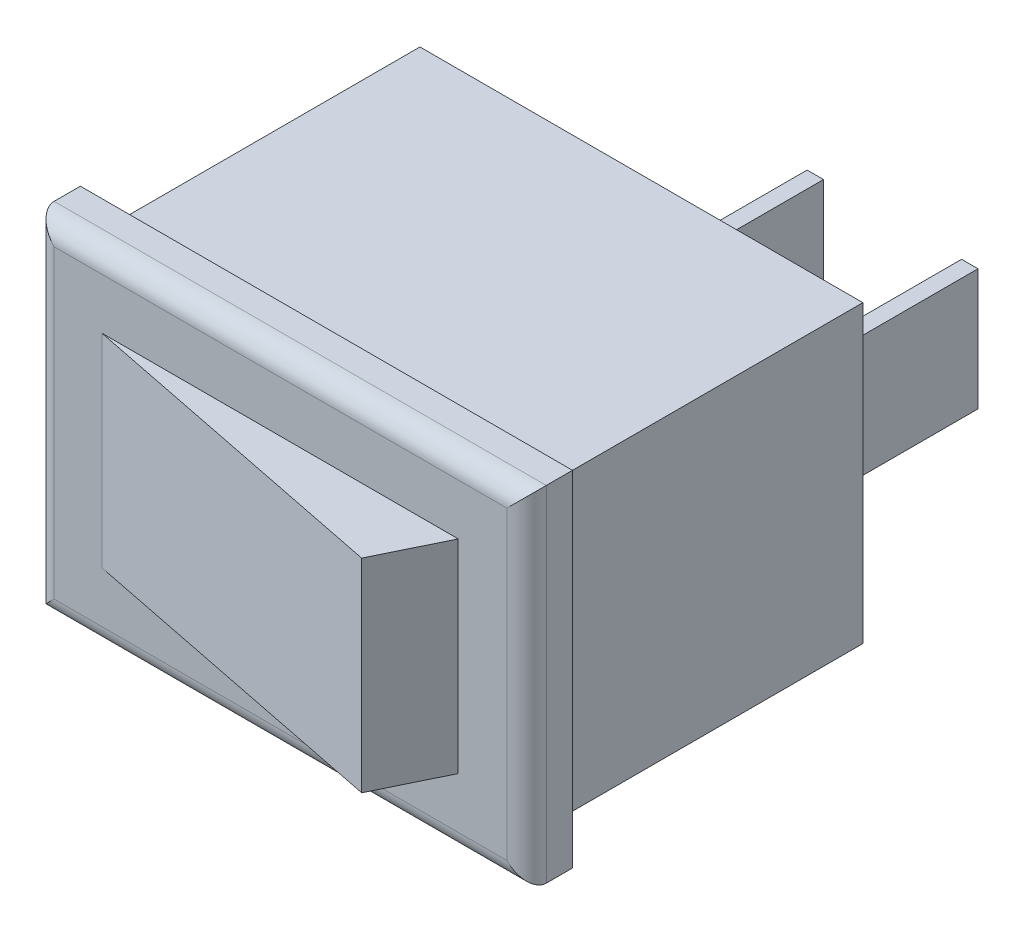
ISO-10303-21;
HEADER;
FILE_DESCRIPTION(('STEP AP214'),'2;1');
FILE_NAME('part.step','',(''),(''),'','','');
FILE_SCHEMA(('AUTOMOTIVE_DESIGN { 1 0 10303 214 1 1 1 1 }'));
ENDSEC;
DATA;
#1=APPLICATION_CONTEXT('core data for automotive mechanical design processes');
#2=APPLICATION_PROTOCOL_DEFINITION('international standard','automotive_design',2000,#1);
#3=PRODUCT_CONTEXT('',#1,'mechanical');
#4=PRODUCT('Part','Part','',(#3));
#5=PRODUCT_RELATED_PRODUCT_CATEGORY('part','',(#4));
#6=PRODUCT_DEFINITION_FORMATION('','',#4);
#7=PRODUCT_DEFINITION_CONTEXT('part definition',#1,'design');
#8=PRODUCT_DEFINITION('design','',#6,#7);
#9=PRODUCT_DEFINITION_SHAPE('','',#8);
#10=(LENGTH_UNIT() NAMED_UNIT(*) SI_UNIT(.MILLI.,.METRE.));
#11=(NAMED_UNIT(*) PLANE_ANGLE_UNIT() SI_UNIT($,.RADIAN.));
#12=(NAMED_UNIT(*) SI_UNIT($,.STERADIAN.) SOLID_ANGLE_UNIT());
#13=UNCERTAINTY_MEASURE_WITH_UNIT(LENGTH_MEASURE(1.E-05),#10,'distance_accuracy_value','');
#14=(GEOMETRIC_REPRESENTATION_CONTEXT(3) GLOBAL_UNCERTAINTY_ASSIGNED_CONTEXT((#13)) GLOBAL_UNIT_ASSIGNED_CONTEXT((#10,
#11,#12)) REPRESENTATION_CONTEXT('',''));
#15=CARTESIAN_POINT('',(0.,0.,0.));
#16=DIRECTION('',(0.,0.,1.));
#17=DIRECTION('',(1.,0.,0.));
#18=AXIS2_PLACEMENT_3D('',#15,#16,#17);
#19=CARTESIAN_POINT('',(0.,0.,-0.3));
#20=DIRECTION('',(0.,0.,1.));
#21=DIRECTION('',(1.,0.,0.));
#22=AXIS2_PLACEMENT_3D('',#19,#20,#21);
#23=PLANE('',#22);
#24=DIRECTION('',(1.,0.,0.));
#25=VECTOR('',#24,1.);
#26=CARTESIAN_POINT('',(5.62503316837021,2.5,-0.3));
#27=LINE('',#26,#25);
#28=CARTESIAN_POINT('',(3.7945058503396,2.5,-0.3));
#29=VERTEX_POINT('',#28);
#30=CARTESIAN_POINT('',(5.62503316837021,2.5,-0.3));
#31=VERTEX_POINT('',#30);
#32=EDGE_CURVE('E271',#29,#31,#27,.T.);
#33=ORIENTED_EDGE('',*,*,#32,.T.);
#34=DIRECTION('',(0.,-1.,0.));
#35=VECTOR('',#34,1.);
#36=CARTESIAN_POINT('',(5.62503316837021,-2.5,-0.3));
#37=LINE('',#36,#35);
#38=CARTESIAN_POINT('',(5.62503316837021,-2.5,-0.3));
#39=VERTEX_POINT('',#38);
#40=EDGE_CURVE('E274',#31,#39,#37,.T.);
#41=ORIENTED_EDGE('',*,*,#40,.T.);
#42=DIRECTION('',(-1.,0.,0.));
#43=VECTOR('',#42,1.);
#44=CARTESIAN_POINT('',(3.7945058503396,-2.5,-0.3));
#45=LINE('',#44,#43);
#46=CARTESIAN_POINT('',(3.7945058503396,-2.5,-0.3));
#47=VERTEX_POINT('',#46);
#48=EDGE_CURVE('E277',#39,#47,#45,.T.);
#49=ORIENTED_EDGE('',*,*,#48,.T.);
#50=DIRECTION('',(0.,1.,0.));
#51=VECTOR('',#50,1.);
#52=CARTESIAN_POINT('',(3.7945058503396,2.5,-0.3));
#53=LINE('',#52,#51);
#54=EDGE_CURVE('E279',#47,#29,#53,.T.);
#55=ORIENTED_EDGE('',*,*,#54,.T.);
#56=EDGE_LOOP('',(#33,#41,#49,#55));
#57=FACE_BOUND('',#56,.T.);
#58=DIRECTION('',(0.,-1.,0.));
#59=VECTOR('',#58,1.);
#60=CARTESIAN_POINT('',(4.95976950935491,-1.85,-0.3));
#61=LINE('',#60,#59);
#62=CARTESIAN_POINT('',(4.95976950935491,1.85,-0.3));
#63=VERTEX_POINT('',#62);
#64=CARTESIAN_POINT('',(4.95976950935491,-1.85,-0.3));
#65=VERTEX_POINT('',#64);
#66=EDGE_CURVE('E261',#63,#65,#61,.T.);
#67=ORIENTED_EDGE('',*,*,#66,.F.);
#68=DIRECTION('',(1.,0.,0.));
#69=VECTOR('',#68,1.);
#70=CARTESIAN_POINT('',(4.95976950935491,1.85,-0.3));
#71=LINE('',#70,#69);
#72=CARTESIAN_POINT('',(4.45976950935491,1.85,-0.3));
#73=VERTEX_POINT('',#72);
#74=EDGE_CURVE('E258',#73,#63,#71,.T.);
#75=ORIENTED_EDGE('',*,*,#74,.F.);
#76=DIRECTION('',(0.,1.,0.));
#77=VECTOR('',#76,1.);
#78=CARTESIAN_POINT('',(4.45976950935491,1.85,-0.3));
#79=LINE('',#78,#77);
#80=CARTESIAN_POINT('',(4.45976950935491,-1.85,-0.3));
#81=VERTEX_POINT('',#80);
#82=EDGE_CURVE('E474',#81,#73,#79,.T.);
#83=ORIENTED_EDGE('',*,*,#82,.F.);
#84=DIRECTION('',(-1.,0.,0.));
#85=VECTOR('',#84,1.);
#86=CARTESIAN_POINT('',(4.45976950935491,-1.85,-0.3));
#87=LINE('',#86,#85);
#88=EDGE_CURVE('E472',#65,#81,#87,.T.);
#89=ORIENTED_EDGE('',*,*,#88,.F.);
#90=EDGE_LOOP('',(#67,#75,#83,#89));
#91=FACE_BOUND('',#90,.T.);
#92=ADVANCED_FACE('F46',(#57,#91),#23,.F.);
#93=CARTESIAN_POINT('',(0.,0.,0.));
#94=DIRECTION('',(0.,0.,1.));
#95=DIRECTION('',(1.,0.,0.));
#96=AXIS2_PLACEMENT_3D('',#93,#94,#95);
#97=PLANE('',#96);
#98=DIRECTION('',(1.,0.,0.));
#99=VECTOR('',#98,1.);
#100=CARTESIAN_POINT('',(0.915263659015306,2.5,0.));
#101=LINE('',#100,#99);
#102=CARTESIAN_POINT('',(-0.915263659015306,2.5,0.));
#103=VERTEX_POINT('',#102);
#104=CARTESIAN_POINT('',(0.915263659015306,2.5,0.));
#105=VERTEX_POINT('',#104);
#106=EDGE_CURVE('E333',#103,#105,#101,.T.);
#107=ORIENTED_EDGE('',*,*,#106,.F.);
#108=DIRECTION('',(0.,1.,0.));
#109=VECTOR('',#108,1.);
#110=CARTESIAN_POINT('',(-0.915263659015306,2.5,0.));
#111=LINE('',#110,#109);
#112=CARTESIAN_POINT('',(-0.915263659015306,-2.5,0.));
#113=VERTEX_POINT('',#112);
#114=EDGE_CURVE('E338',#113,#103,#111,.T.);
#115=ORIENTED_EDGE('',*,*,#114,.F.);
#116=DIRECTION('',(-1.,0.,0.));
#117=VECTOR('',#116,1.);
#118=CARTESIAN_POINT('',(-0.915263659015306,-2.5,0.));
#119=LINE('',#118,#117);
#120=CARTESIAN_POINT('',(0.915263659015306,-2.5,0.));
#121=VERTEX_POINT('',#120);
#122=EDGE_CURVE('E350',#121,#113,#119,.T.);
#123=ORIENTED_EDGE('',*,*,#122,.F.);
#124=DIRECTION('',(0.,-1.,0.));
#125=VECTOR('',#124,1.);
#126=CARTESIAN_POINT('',(0.915263659015306,-2.5,0.));
#127=LINE('',#126,#125);
#128=EDGE_CURVE('E347',#105,#121,#127,.T.);
#129=ORIENTED_EDGE('',*,*,#128,.F.);
#130=EDGE_LOOP('',(#107,#115,#123,#129));
#131=FACE_BOUND('',#130,.T.);
#132=DIRECTION('',(-1.,0.,0.));
#133=VECTOR('',#132,1.);
#134=CARTESIAN_POINT('',(-6.75,-4.5,0.));
#135=LINE('',#134,#133);
#136=CARTESIAN_POINT('',(6.75,-4.5,0.));
#137=VERTEX_POINT('',#136);
#138=CARTESIAN_POINT('',(-6.75,-4.5,0.));
#139=VERTEX_POINT('',#138);
#140=EDGE_CURVE('E367',#137,#139,#135,.T.);
#141=ORIENTED_EDGE('',*,*,#140,.T.);
#142=DIRECTION('',(0.,1.,0.));
#143=VECTOR('',#142,1.);
#144=CARTESIAN_POINT('',(-6.75,4.5,0.));
#145=LINE('',#144,#143);
#146=CARTESIAN_POINT('',(-6.75,4.5,0.));
#147=VERTEX_POINT('',#146);
#148=EDGE_CURVE('E370',#139,#147,#145,.T.);
#149=ORIENTED_EDGE('',*,*,#148,.T.);
#150=DIRECTION('',(1.,0.,0.));
#151=VECTOR('',#150,1.);
#152=CARTESIAN_POINT('',(6.75,4.5,0.));
#153=LINE('',#152,#151);
#154=CARTESIAN_POINT('',(6.75,4.5,0.));
#155=VERTEX_POINT('',#154);
#156=EDGE_CURVE('E373',#147,#155,#153,.T.);
#157=ORIENTED_EDGE('',*,*,#156,.T.);
#158=DIRECTION('',(0.,-1.,0.));
#159=VECTOR('',#158,1.);
#160=CARTESIAN_POINT('',(6.75,-4.5,0.));
#161=LINE('',#160,#159);
#162=EDGE_CURVE('E375',#155,#137,#161,.T.);
#163=ORIENTED_EDGE('',*,*,#162,.T.);
#164=EDGE_LOOP('',(#141,#149,#157,#163));
#165=FACE_BOUND('',#164,.T.);
#166=DIRECTION('',(1.,0.,0.));
#167=VECTOR('',#166,1.);
#168=CARTESIAN_POINT('',(5.62503316837021,2.5,0.));
#169=LINE('',#168,#167);
#170=CARTESIAN_POINT('',(3.7945058503396,2.5,0.));
#171=VERTEX_POINT('',#170);
#172=CARTESIAN_POINT('',(5.62503316837021,2.5,0.));
#173=VERTEX_POINT('',#172);
#174=EDGE_CURVE('E262',#171,#173,#169,.T.);
#175=ORIENTED_EDGE('',*,*,#174,.F.);
#176=DIRECTION('',(0.,1.,0.));
#177=VECTOR('',#176,1.);
#178=CARTESIAN_POINT('',(3.7945058503396,2.5,0.));
#179=LINE('',#178,#177);
#180=CARTESIAN_POINT('',(3.7945058503396,-2.5,0.));
#181=VERTEX_POINT('',#180);
#182=EDGE_CURVE('E275',#181,#171,#179,.T.);
#183=ORIENTED_EDGE('',*,*,#182,.F.);
#184=DIRECTION('',(-1.,0.,0.));
#185=VECTOR('',#184,1.);
#186=CARTESIAN_POINT('',(3.7945058503396,-2.5,0.));
#187=LINE('',#186,#185);
#188=CARTESIAN_POINT('',(5.62503316837021,-2.5,0.));
#189=VERTEX_POINT('',#188);
#190=EDGE_CURVE('E284',#189,#181,#187,.T.);
#191=ORIENTED_EDGE('',*,*,#190,.F.);
#192=DIRECTION('',(0.,-1.,0.));
#193=VECTOR('',#192,1.);
#194=CARTESIAN_POINT('',(5.62503316837021,-2.5,0.));
#195=LINE('',#194,#193);
#196=EDGE_CURVE('E265',#173,#189,#195,.T.);
#197=ORIENTED_EDGE('',*,*,#196,.F.);
#198=EDGE_LOOP('',(#175,#183,#191,#197));
#199=FACE_BOUND('',#198,.T.);
#200=ADVANCED_FACE('F492',(#131,#165,#199),#97,.F.);
#201=CARTESIAN_POINT('',(0.,0.,-0.3));
#202=DIRECTION('',(0.,0.,1.));
#203=DIRECTION('',(1.,0.,0.));
#204=AXIS2_PLACEMENT_3D('',#201,#202,#203);
#205=PLANE('',#204);
#206=DIRECTION('',(1.,0.,0.));
#207=VECTOR('',#206,1.);
#208=CARTESIAN_POINT('',(0.915263659015306,2.5,-0.3));
#209=LINE('',#208,#207);
#210=CARTESIAN_POINT('',(-0.915263659015306,2.5,-0.3));
#211=VERTEX_POINT('',#210);
#212=CARTESIAN_POINT('',(0.915263659015306,2.5,-0.3));
#213=VERTEX_POINT('',#212);
#214=EDGE_CURVE('E334',#211,#213,#209,.T.);
#215=ORIENTED_EDGE('',*,*,#214,.T.);
#216=DIRECTION('',(0.,-1.,0.));
#217=VECTOR('',#216,1.);
#218=CARTESIAN_POINT('',(0.915263659015306,-2.5,-0.3));
#219=LINE('',#218,#217);
#220=CARTESIAN_POINT('',(0.915263659015306,-2.5,-0.3));
#221=VERTEX_POINT('',#220);
#222=EDGE_CURVE('E337',#213,#221,#219,.T.);
#223=ORIENTED_EDGE('',*,*,#222,.T.);
#224=DIRECTION('',(-1.,0.,0.));
#225=VECTOR('',#224,1.);
#226=CARTESIAN_POINT('',(-0.915263659015306,-2.5,-0.3));
#227=LINE('',#226,#225);
#228=CARTESIAN_POINT('',(-0.915263659015306,-2.5,-0.3));
#229=VERTEX_POINT('',#228);
#230=EDGE_CURVE('E340',#221,#229,#227,.T.);
#231=ORIENTED_EDGE('',*,*,#230,.T.);
#232=DIRECTION('',(0.,1.,0.));
#233=VECTOR('',#232,1.);
#234=CARTESIAN_POINT('',(-0.915263659015306,2.5,-0.3));
#235=LINE('',#234,#233);
#236=EDGE_CURVE('E342',#229,#211,#235,.T.);
#237=ORIENTED_EDGE('',*,*,#236,.T.);
#238=EDGE_LOOP('',(#215,#223,#231,#237));
#239=FACE_BOUND('',#238,.T.);
#240=DIRECTION('',(1.,0.,0.));
#241=VECTOR('',#240,1.);
#242=CARTESIAN_POINT('',(0.25,1.85,-0.3));
#243=LINE('',#242,#241);
#244=CARTESIAN_POINT('',(-0.25,1.85,-0.3));
#245=VERTEX_POINT('',#244);
#246=CARTESIAN_POINT('',(0.25,1.85,-0.3));
#247=VERTEX_POINT('',#246);
#248=EDGE_CURVE('E300',#245,#247,#243,.T.);
#249=ORIENTED_EDGE('',*,*,#248,.F.);
#250=DIRECTION('',(0.,1.,0.));
#251=VECTOR('',#250,1.);
#252=CARTESIAN_POINT('',(-0.25,1.85,-0.3));
#253=LINE('',#252,#251);
#254=CARTESIAN_POINT('',(-0.25,-1.85,-0.3));
#255=VERTEX_POINT('',#254);
#256=EDGE_CURVE('E305',#255,#245,#253,.T.);
#257=ORIENTED_EDGE('',*,*,#256,.F.);
#258=DIRECTION('',(-1.,0.,0.));
#259=VECTOR('',#258,1.);
#260=CARTESIAN_POINT('',(-0.25,-1.85,-0.3));
#261=LINE('',#260,#259);
#262=CARTESIAN_POINT('',(0.25,-1.85,-0.3));
#263=VERTEX_POINT('',#262);
#264=EDGE_CURVE('E317',#263,#255,#261,.T.);
#265=ORIENTED_EDGE('',*,*,#264,.F.);
#266=DIRECTION('',(0.,-1.,0.));
#267=VECTOR('',#266,1.);
#268=CARTESIAN_POINT('',(0.25,-1.85,-0.3));
#269=LINE('',#268,#267);
#270=EDGE_CURVE('E314',#247,#263,#269,.T.);
#271=ORIENTED_EDGE('',*,*,#270,.F.);
#272=EDGE_LOOP('',(#249,#257,#265,#271));
#273=FACE_BOUND('',#272,.T.);
#274=ADVANCED_FACE('F498',(#239,#273),#205,.F.);
#275=CARTESIAN_POINT('',(0.,0.,9.6));
#276=DIRECTION('',(0.,0.,1.));
#277=DIRECTION('',(1.,0.,0.));
#278=AXIS2_PLACEMENT_3D('',#275,#276,#277);
#279=PLANE('',#278);
#280=DIRECTION('',(-1.,0.,0.));
#281=VECTOR('',#280,1.);
#282=CARTESIAN_POINT('',(7.5,5.25,9.6));
#283=LINE('',#282,#281);
#284=CARTESIAN_POINT('',(7.5,5.25,9.6));
#285=VERTEX_POINT('',#284);
#286=CARTESIAN_POINT('',(-7.5,5.25,9.6));
#287=VERTEX_POINT('',#286);
#288=EDGE_CURVE('E415',#285,#287,#283,.T.);
#289=ORIENTED_EDGE('',*,*,#288,.F.);
#290=DIRECTION('',(0.,1.,0.));
#291=VECTOR('',#290,1.);
#292=CARTESIAN_POINT('',(7.5,-5.25,9.6));
#293=LINE('',#292,#291);
#294=CARTESIAN_POINT('',(7.5,-5.25,9.6));
#295=VERTEX_POINT('',#294);
#296=EDGE_CURVE('E427',#295,#285,#293,.T.);
#297=ORIENTED_EDGE('',*,*,#296,.F.);
#298=DIRECTION('',(1.,0.,0.));
#299=VECTOR('',#298,1.);
#300=CARTESIAN_POINT('',(-7.5,-5.25,9.6));
#301=LINE('',#300,#299);
#302=CARTESIAN_POINT('',(-7.5,-5.25,9.6));
#303=VERTEX_POINT('',#302);
#304=EDGE_CURVE('E424',#303,#295,#301,.T.);
#305=ORIENTED_EDGE('',*,*,#304,.F.);
#306=DIRECTION('',(0.,-1.,0.));
#307=VECTOR('',#306,1.);
#308=CARTESIAN_POINT('',(-7.5,5.25,9.6));
#309=LINE('',#308,#307);
#310=EDGE_CURVE('E421',#287,#303,#309,.T.);
#311=ORIENTED_EDGE('',*,*,#310,.F.);
#312=EDGE_LOOP('',(#289,#297,#305,#311));
#313=FACE_BOUND('',#312,.T.);
#314=DIRECTION('',(-1.,0.,0.));
#315=VECTOR('',#314,1.);
#316=CARTESIAN_POINT('',(-6.75,-4.5,9.6));
#317=LINE('',#316,#315);
#318=CARTESIAN_POINT('',(6.75,-4.5,9.6));
#319=VERTEX_POINT('',#318);
#320=CARTESIAN_POINT('',(-6.75,-4.5,9.6));
#321=VERTEX_POINT('',#320);
#322=EDGE_CURVE('E366',#319,#321,#317,.T.);
#323=ORIENTED_EDGE('',*,*,#322,.F.);
#324=DIRECTION('',(0.,-1.,0.));
#325=VECTOR('',#324,1.);
#326=CARTESIAN_POINT('',(6.75,-4.5,9.6));
#327=LINE('',#326,#325);
#328=CARTESIAN_POINT('',(6.75,4.5,9.6));
#329=VERTEX_POINT('',#328);
#330=EDGE_CURVE('E371',#329,#319,#327,.T.);
#331=ORIENTED_EDGE('',*,*,#330,.F.);
#332=DIRECTION('',(1.,0.,0.));
#333=VECTOR('',#332,1.);
#334=CARTESIAN_POINT('',(6.75,4.5,9.6));
#335=LINE('',#334,#333);
#336=CARTESIAN_POINT('',(-6.75,4.5,9.6));
#337=VERTEX_POINT('',#336);
#338=EDGE_CURVE('E383',#337,#329,#335,.T.);
#339=ORIENTED_EDGE('',*,*,#338,.F.);
#340=DIRECTION('',(0.,1.,0.));
#341=VECTOR('',#340,1.);
#342=CARTESIAN_POINT('',(-6.75,4.5,9.6));
#343=LINE('',#342,#341);
#344=EDGE_CURVE('E380',#321,#337,#343,.T.);
#345=ORIENTED_EDGE('',*,*,#344,.F.);
#346=EDGE_LOOP('',(#323,#331,#339,#345));
#347=FACE_BOUND('',#346,.T.);
#348=ADVANCED_FACE('F543',(#313,#347),#279,.F.);
#349=CARTESIAN_POINT('',(7.5,5.25,9.6));
#350=DIRECTION('',(0.,1.,0.));
#351=DIRECTION('',(-1.,0.,0.));
#352=AXIS2_PLACEMENT_3D('',#349,#350,#351);
#353=PLANE('',#352);
#354=DIRECTION('',(0.,0.,1.));
#355=VECTOR('',#354,1.);
#356=CARTESIAN_POINT('',(-7.5,5.25,9.6));
#357=LINE('',#356,#355);
#358=CARTESIAN_POINT('',(-7.5,5.25,10.4));
#359=VERTEX_POINT('',#358);
#360=EDGE_CURVE('E430',#287,#359,#357,.T.);
#361=ORIENTED_EDGE('',*,*,#360,.T.);
#362=DIRECTION('',(-1.,0.,0.));
#363=VECTOR('',#362,1.);
#364=CARTESIAN_POINT('',(7.5,5.25,10.4));
#365=LINE('',#364,#363);
#366=CARTESIAN_POINT('',(7.5,5.25,10.4));
#367=VERTEX_POINT('',#366);
#368=EDGE_CURVE('E456',#359,#367,#365,.F.);
#369=ORIENTED_EDGE('',*,*,#368,.T.);
#370=DIRECTION('',(0.,0.,1.));
#371=VECTOR('',#370,1.);
#372=CARTESIAN_POINT('',(7.5,5.25,9.6));
#373=LINE('',#372,#371);
#374=EDGE_CURVE('E431',#285,#367,#373,.T.);
#375=ORIENTED_EDGE('',*,*,#374,.F.);
#376=ORIENTED_EDGE('',*,*,#288,.T.);
#377=EDGE_LOOP('',(#361,#369,#375,#376));
#378=FACE_BOUND('',#377,.T.);
#379=ADVANCED_FACE('F592',(#378),#353,.T.);
#380=CARTESIAN_POINT('',(7.5,-5.25,9.6));
#381=DIRECTION('',(1.,0.,0.));
#382=DIRECTION('',(0.,1.,0.));
#383=AXIS2_PLACEMENT_3D('',#380,#381,#382);
#384=PLANE('',#383);
#385=ORIENTED_EDGE('',*,*,#374,.T.);
#386=DIRECTION('',(0.,1.,0.));
#387=VECTOR('',#386,1.);
#388=CARTESIAN_POINT('',(7.5,-5.25,10.4));
#389=LINE('',#388,#387);
#390=CARTESIAN_POINT('',(7.5,-5.25,10.4));
#391=VERTEX_POINT('',#390);
#392=EDGE_CURVE('E453',#367,#391,#389,.F.);
#393=ORIENTED_EDGE('',*,*,#392,.T.);
#394=DIRECTION('',(0.,0.,1.));
#395=VECTOR('',#394,1.);
#396=CARTESIAN_POINT('',(7.5,-5.25,9.6));
#397=LINE('',#396,#395);
#398=EDGE_CURVE('E435',#295,#391,#397,.T.);
#399=ORIENTED_EDGE('',*,*,#398,.F.);
#400=ORIENTED_EDGE('',*,*,#296,.T.);
#401=EDGE_LOOP('',(#385,#393,#399,#400));
#402=FACE_BOUND('',#401,.T.);
#403=ADVANCED_FACE('F598',(#402),#384,.T.);
#404=CARTESIAN_POINT('',(-7.5,-5.25,9.6));
#405=DIRECTION('',(0.,-1.,0.));
#406=DIRECTION('',(1.,0.,0.));
#407=AXIS2_PLACEMENT_3D('',#404,#405,#406);
#408=PLANE('',#407);
#409=ORIENTED_EDGE('',*,*,#398,.T.);
#410=DIRECTION('',(1.,0.,0.));
#411=VECTOR('',#410,1.);
#412=CARTESIAN_POINT('',(-7.5,-5.25,10.4));
#413=LINE('',#412,#411);
#414=CARTESIAN_POINT('',(-7.5,-5.25,10.4));
#415=VERTEX_POINT('',#414);
#416=EDGE_CURVE('E55',#391,#415,#413,.F.);
#417=ORIENTED_EDGE('',*,*,#416,.T.);
#418=DIRECTION('',(0.,0.,1.));
#419=VECTOR('',#418,1.);
#420=CARTESIAN_POINT('',(-7.5,-5.25,9.6));
#421=LINE('',#420,#419);
#422=EDGE_CURVE('E437',#303,#415,#421,.T.);
#423=ORIENTED_EDGE('',*,*,#422,.F.);
#424=ORIENTED_EDGE('',*,*,#304,.T.);
#425=EDGE_LOOP('',(#409,#417,#423,#424));
#426=FACE_BOUND('',#425,.T.);
#427=ADVANCED_FACE('F601',(#426),#408,.T.);
#428=CARTESIAN_POINT('',(-7.5,5.25,9.6));
#429=DIRECTION('',(-1.,0.,0.));
#430=DIRECTION('',(0.,-1.,0.));
#431=AXIS2_PLACEMENT_3D('',#428,#429,#430);
#432=PLANE('',#431);
#433=ORIENTED_EDGE('',*,*,#422,.T.);
#434=DIRECTION('',(0.,-1.,0.));
#435=VECTOR('',#434,1.);
#436=CARTESIAN_POINT('',(-7.5,5.25,10.4));
#437=LINE('',#436,#435);
#438=EDGE_CURVE('E11',#415,#359,#437,.F.);
#439=ORIENTED_EDGE('',*,*,#438,.T.);
#440=ORIENTED_EDGE('',*,*,#360,.F.);
#441=ORIENTED_EDGE('',*,*,#310,.T.);
#442=EDGE_LOOP('',(#433,#439,#440,#441));
#443=FACE_BOUND('',#442,.T.);
#444=ADVANCED_FACE('F596',(#443),#432,.T.);
#445=CARTESIAN_POINT('',(0.,0.,11.));
#446=DIRECTION('',(0.,0.,1.));
#447=DIRECTION('',(1.,0.,0.));
#448=AXIS2_PLACEMENT_3D('',#445,#446,#447);
#449=PLANE('',#448);
#450=DIRECTION('',(1.,0.,0.));
#451=VECTOR('',#450,1.);
#452=CARTESIAN_POINT('',(0.,-4.65,11.));
#453=LINE('',#452,#451);
#454=CARTESIAN_POINT('',(-6.9,-4.65,11.));
#455=VERTEX_POINT('',#454);
#456=CARTESIAN_POINT('',(6.9,-4.65,11.));
#457=VERTEX_POINT('',#456);
#458=EDGE_CURVE('E446',#455,#457,#453,.T.);
#459=ORIENTED_EDGE('',*,*,#458,.T.);
#460=DIRECTION('',(0.,1.,0.));
#461=VECTOR('',#460,1.);
#462=CARTESIAN_POINT('',(6.9,0.,11.));
#463=LINE('',#462,#461);
#464=CARTESIAN_POINT('',(6.9,4.65,11.));
#465=VERTEX_POINT('',#464);
#466=EDGE_CURVE('E450',#457,#465,#463,.T.);
#467=ORIENTED_EDGE('',*,*,#466,.T.);
#468=DIRECTION('',(-1.,0.,0.));
#469=VECTOR('',#468,1.);
#470=CARTESIAN_POINT('',(0.,4.65,11.));
#471=LINE('',#470,#469);
#472=CARTESIAN_POINT('',(-6.9,4.65,11.));
#473=VERTEX_POINT('',#472);
#474=EDGE_CURVE('E448',#465,#473,#471,.T.);
#475=ORIENTED_EDGE('',*,*,#474,.T.);
#476=DIRECTION('',(0.,-1.,0.));
#477=VECTOR('',#476,1.);
#478=CARTESIAN_POINT('',(-6.9,0.,11.));
#479=LINE('',#478,#477);
#480=EDGE_CURVE('E434',#473,#455,#479,.T.);
#481=ORIENTED_EDGE('',*,*,#480,.T.);
#482=EDGE_LOOP('',(#459,#467,#475,#481));
#483=FACE_BOUND('',#482,.T.);
#484=DIRECTION('',(1.,0.,0.));
#485=VECTOR('',#484,1.);
#486=CARTESIAN_POINT('',(-5.44132525101304,-3.09739238582551,11.));
#487=LINE('',#486,#485);
#488=CARTESIAN_POINT('',(-5.44132525101304,-3.09739238582551,11.));
#489=VERTEX_POINT('',#488);
#490=CARTESIAN_POINT('',(5.41679042814476,-3.09739238582551,11.));
#491=VERTEX_POINT('',#490);
#492=EDGE_CURVE('E399',#489,#491,#487,.T.);
#493=ORIENTED_EDGE('',*,*,#492,.F.);
#494=DIRECTION('',(0.,-1.,0.));
#495=VECTOR('',#494,1.);
#496=CARTESIAN_POINT('',(-5.44132525101304,3.09739238582551,11.));
#497=LINE('',#496,#495);
#498=CARTESIAN_POINT('',(-5.44132525101304,3.09739238582551,11.));
#499=VERTEX_POINT('',#498);
#500=EDGE_CURVE('E413',#499,#489,#497,.T.);
#501=ORIENTED_EDGE('',*,*,#500,.F.);
#502=DIRECTION('',(1.,0.,0.));
#503=VECTOR('',#502,1.);
#504=CARTESIAN_POINT('',(-5.44132525101304,3.09739238582551,11.));
#505=LINE('',#504,#503);
#506=CARTESIAN_POINT('',(5.41679042814476,3.09739238582551,11.));
#507=VERTEX_POINT('',#506);
#508=EDGE_CURVE('E400',#499,#507,#505,.T.);
#509=ORIENTED_EDGE('',*,*,#508,.T.);
#510=DIRECTION('',(0.,-1.,0.));
#511=VECTOR('',#510,1.);
#512=CARTESIAN_POINT('',(5.41679042814476,3.09739238582551,11.));
#513=LINE('',#512,#511);
#514=EDGE_CURVE('E408',#507,#491,#513,.T.);
#515=ORIENTED_EDGE('',*,*,#514,.T.);
#516=EDGE_LOOP('',(#493,#501,#509,#515));
#517=FACE_BOUND('',#516,.T.);
#518=ADVANCED_FACE('F588',(#483,#517),#449,.T.);
#519=CARTESIAN_POINT('',(5.41679042814476,3.09739238582551,13.1716231358316));
#520=DIRECTION('',(-0.196116135138183,0.,0.98058067569092));
#521=DIRECTION('',(0.98058067569092,0.,0.196116135138183));
#522=AXIS2_PLACEMENT_3D('',#519,#520,#521);
#523=PLANE('',#522);
#524=DIRECTION('',(-0.98058067569092,0.,-0.196116135138183));
#525=VECTOR('',#524,1.);
#526=CARTESIAN_POINT('',(5.41679042814476,-3.09739238582551,13.1716231358316));
#527=LINE('',#526,#525);
#528=CARTESIAN_POINT('',(4.45175490907126,-3.09739238582551,12.9786160320169));
#529=VERTEX_POINT('',#528);
#530=EDGE_CURVE('E404',#529,#489,#527,.T.);
#531=ORIENTED_EDGE('',*,*,#530,.F.);
#532=DIRECTION('',(0.,-1.,0.));
#533=VECTOR('',#532,1.);
#534=CARTESIAN_POINT('',(4.45175490907126,3.09739238582551,12.9786160320169));
#535=LINE('',#534,#533);
#536=CARTESIAN_POINT('',(4.45175490907126,3.09739238582551,12.9786160320169));
#537=VERTEX_POINT('',#536);
#538=EDGE_CURVE('E416',#537,#529,#535,.T.);
#539=ORIENTED_EDGE('',*,*,#538,.F.);
#540=DIRECTION('',(-0.98058067569092,0.,-0.196116135138183));
#541=VECTOR('',#540,1.);
#542=CARTESIAN_POINT('',(5.41679042814476,3.09739238582551,13.1716231358316));
#543=LINE('',#542,#541);
#544=EDGE_CURVE('E405',#537,#499,#543,.T.);
#545=ORIENTED_EDGE('',*,*,#544,.T.);
#546=ORIENTED_EDGE('',*,*,#500,.T.);
#547=EDGE_LOOP('',(#531,#539,#545,#546));
#548=FACE_BOUND('',#547,.T.);
#549=ADVANCED_FACE('F585',(#548),#523,.T.);
#550=CARTESIAN_POINT('',(5.41679042814476,3.09739238582551,11.));
#551=DIRECTION('',(0.898794046299165,0.,0.438371146789081));
#552=DIRECTION('',(0.438371146789081,0.,-0.898794046299165));
#553=AXIS2_PLACEMENT_3D('',#550,#551,#552);
#554=PLANE('',#553);
#555=DIRECTION('',(-0.438371146789081,0.,0.898794046299165));
#556=VECTOR('',#555,1.);
#557=CARTESIAN_POINT('',(8.70990895217011,-3.09739238582551,4.24810643941494));
#558=LINE('',#557,#556);
#559=EDGE_CURVE('E410',#491,#529,#558,.T.);
#560=ORIENTED_EDGE('',*,*,#559,.F.);
#561=ORIENTED_EDGE('',*,*,#514,.F.);
#562=DIRECTION('',(-0.438371146789081,0.,0.898794046299165));
#563=VECTOR('',#562,1.);
#564=CARTESIAN_POINT('',(8.70990895217011,3.09739238582551,4.24810643941494));
#565=LINE('',#564,#563);
#566=EDGE_CURVE('E403',#507,#537,#565,.T.);
#567=ORIENTED_EDGE('',*,*,#566,.T.);
#568=ORIENTED_EDGE('',*,*,#538,.T.);
#569=EDGE_LOOP('',(#560,#561,#567,#568));
#570=FACE_BOUND('',#569,.T.);
#571=ADVANCED_FACE('F580',(#570),#554,.T.);
#572=CARTESIAN_POINT('',(0.,3.09739238582551,0.));
#573=DIRECTION('',(0.,-1.,0.));
#574=DIRECTION('',(0.,0.,-1.));
#575=AXIS2_PLACEMENT_3D('',#572,#573,#574);
#576=PLANE('',#575);
#577=ORIENTED_EDGE('',*,*,#508,.F.);
#578=ORIENTED_EDGE('',*,*,#544,.F.);
#579=ORIENTED_EDGE('',*,*,#566,.F.);
#580=EDGE_LOOP('',(#577,#578,#579));
#581=FACE_BOUND('',#580,.T.);
#582=ADVANCED_FACE('F577',(#581),#576,.F.);
#583=CARTESIAN_POINT('',(0.,-3.09739238582551,0.));
#584=DIRECTION('',(0.,-1.,0.));
#585=DIRECTION('',(0.,0.,-1.));
#586=AXIS2_PLACEMENT_3D('',#583,#584,#585);
#587=PLANE('',#586);
#588=ORIENTED_EDGE('',*,*,#492,.T.);
#589=ORIENTED_EDGE('',*,*,#559,.T.);
#590=ORIENTED_EDGE('',*,*,#530,.T.);
#591=EDGE_LOOP('',(#588,#589,#590));
#592=FACE_BOUND('',#591,.T.);
#593=ADVANCED_FACE('F575',(#592),#587,.T.);
#594=CARTESIAN_POINT('',(-6.75,-4.5,0.));
#595=DIRECTION('',(0.,1.,0.));
#596=DIRECTION('',(0.,0.,1.));
#597=AXIS2_PLACEMENT_3D('',#594,#595,#596);
#598=PLANE('',#597);
#599=ORIENTED_EDGE('',*,*,#322,.T.);
#600=DIRECTION('',(0.,0.,1.));
#601=VECTOR('',#600,1.);
#602=CARTESIAN_POINT('',(-6.75,-4.5,0.));
#603=LINE('',#602,#601);
#604=EDGE_CURVE('E396',#139,#321,#603,.T.);
#605=ORIENTED_EDGE('',*,*,#604,.F.);
#606=ORIENTED_EDGE('',*,*,#140,.F.);
#607=DIRECTION('',(0.,0.,1.));
#608=VECTOR('',#607,1.);
#609=CARTESIAN_POINT('',(6.75,-4.5,0.));
#610=LINE('',#609,#608);
#611=EDGE_CURVE('E377',#137,#319,#610,.T.);
#612=ORIENTED_EDGE('',*,*,#611,.T.);
#613=EDGE_LOOP('',(#599,#605,#606,#612));
#614=FACE_BOUND('',#613,.T.);
#615=ADVANCED_FACE('F571',(#614),#598,.F.);
#616=CARTESIAN_POINT('',(-6.75,4.5,0.));
#617=DIRECTION('',(1.,0.,0.));
#618=DIRECTION('',(0.,0.,-1.));
#619=AXIS2_PLACEMENT_3D('',#616,#617,#618);
#620=PLANE('',#619);
#621=ORIENTED_EDGE('',*,*,#344,.T.);
#622=DIRECTION('',(0.,0.,1.));
#623=VECTOR('',#622,1.);
#624=CARTESIAN_POINT('',(-6.75,4.5,0.));
#625=LINE('',#624,#623);
#626=EDGE_CURVE('E393',#147,#337,#625,.T.);
#627=ORIENTED_EDGE('',*,*,#626,.F.);
#628=ORIENTED_EDGE('',*,*,#148,.F.);
#629=ORIENTED_EDGE('',*,*,#604,.T.);
#630=EDGE_LOOP('',(#621,#627,#628,#629));
#631=FACE_BOUND('',#630,.T.);
#632=ADVANCED_FACE('F567',(#631),#620,.F.);
#633=CARTESIAN_POINT('',(6.75,4.5,0.));
#634=DIRECTION('',(0.,-1.,0.));
#635=DIRECTION('',(0.,0.,-1.));
#636=AXIS2_PLACEMENT_3D('',#633,#634,#635);
#637=PLANE('',#636);
#638=ORIENTED_EDGE('',*,*,#338,.T.);
#639=DIRECTION('',(0.,0.,1.));
#640=VECTOR('',#639,1.);
#641=CARTESIAN_POINT('',(6.75,4.5,0.));
#642=LINE('',#641,#640);
#643=EDGE_CURVE('E390',#155,#329,#642,.T.);
#644=ORIENTED_EDGE('',*,*,#643,.F.);
#645=ORIENTED_EDGE('',*,*,#156,.F.);
#646=ORIENTED_EDGE('',*,*,#626,.T.);
#647=EDGE_LOOP('',(#638,#644,#645,#646));
#648=FACE_BOUND('',#647,.T.);
#649=ADVANCED_FACE('F563',(#648),#637,.F.);
#650=CARTESIAN_POINT('',(6.75,-4.5,0.));
#651=DIRECTION('',(-1.,0.,0.));
#652=DIRECTION('',(0.,0.,1.));
#653=AXIS2_PLACEMENT_3D('',#650,#651,#652);
#654=PLANE('',#653);
#655=ORIENTED_EDGE('',*,*,#330,.T.);
#656=ORIENTED_EDGE('',*,*,#611,.F.);
#657=ORIENTED_EDGE('',*,*,#162,.F.);
#658=ORIENTED_EDGE('',*,*,#643,.T.);
#659=EDGE_LOOP('',(#655,#656,#657,#658));
#660=FACE_BOUND('',#659,.T.);
#661=ADVANCED_FACE('F558',(#660),#654,.F.);
#662=CARTESIAN_POINT('',(0.915263659015306,2.5,-0.3));
#663=DIRECTION('',(0.,-1.,0.));
#664=DIRECTION('',(0.,0.,-1.));
#665=AXIS2_PLACEMENT_3D('',#662,#663,#664);
#666=PLANE('',#665);
#667=ORIENTED_EDGE('',*,*,#106,.T.);
#668=DIRECTION('',(0.,0.,1.));
#669=VECTOR('',#668,1.);
#670=CARTESIAN_POINT('',(0.915263659015306,2.5,-0.3));
#671=LINE('',#670,#669);
#672=EDGE_CURVE('E363',#213,#105,#671,.T.);
#673=ORIENTED_EDGE('',*,*,#672,.F.);
#674=ORIENTED_EDGE('',*,*,#214,.F.);
#675=DIRECTION('',(0.,0.,1.));
#676=VECTOR('',#675,1.);
#677=CARTESIAN_POINT('',(-0.915263659015306,2.5,-0.3));
#678=LINE('',#677,#676);
#679=EDGE_CURVE('E344',#211,#103,#678,.T.);
#680=ORIENTED_EDGE('',*,*,#679,.T.);
#681=EDGE_LOOP('',(#667,#673,#674,#680));
#682=FACE_BOUND('',#681,.T.);
#683=ADVANCED_FACE('F555',(#682),#666,.F.);
#684=CARTESIAN_POINT('',(0.915263659015306,-2.5,-0.3));
#685=DIRECTION('',(-1.,0.,0.));
#686=DIRECTION('',(0.,0.,1.));
#687=AXIS2_PLACEMENT_3D('',#684,#685,#686);
#688=PLANE('',#687);
#689=ORIENTED_EDGE('',*,*,#128,.T.);
#690=DIRECTION('',(0.,0.,1.));
#691=VECTOR('',#690,1.);
#692=CARTESIAN_POINT('',(0.915263659015306,-2.5,-0.3));
#693=LINE('',#692,#691);
#694=EDGE_CURVE('E360',#221,#121,#693,.T.);
#695=ORIENTED_EDGE('',*,*,#694,.F.);
#696=ORIENTED_EDGE('',*,*,#222,.F.);
#697=ORIENTED_EDGE('',*,*,#672,.T.);
#698=EDGE_LOOP('',(#689,#695,#696,#697));
#699=FACE_BOUND('',#698,.T.);
#700=ADVANCED_FACE('F551',(#699),#688,.F.);
#701=CARTESIAN_POINT('',(-0.915263659015306,-2.5,-0.3));
#702=DIRECTION('',(0.,1.,0.));
#703=DIRECTION('',(0.,0.,1.));
#704=AXIS2_PLACEMENT_3D('',#701,#702,#703);
#705=PLANE('',#704);
#706=ORIENTED_EDGE('',*,*,#122,.T.);
#707=DIRECTION('',(0.,0.,1.));
#708=VECTOR('',#707,1.);
#709=CARTESIAN_POINT('',(-0.915263659015306,-2.5,-0.3));
#710=LINE('',#709,#708);
#711=EDGE_CURVE('E357',#229,#113,#710,.T.);
#712=ORIENTED_EDGE('',*,*,#711,.F.);
#713=ORIENTED_EDGE('',*,*,#230,.F.);
#714=ORIENTED_EDGE('',*,*,#694,.T.);
#715=EDGE_LOOP('',(#706,#712,#713,#714));
#716=FACE_BOUND('',#715,.T.);
#717=ADVANCED_FACE('F547',(#716),#705,.F.);
#718=CARTESIAN_POINT('',(-0.915263659015306,2.5,-0.3));
#719=DIRECTION('',(1.,0.,0.));
#720=DIRECTION('',(0.,0.,-1.));
#721=AXIS2_PLACEMENT_3D('',#718,#719,#720);
#722=PLANE('',#721);
#723=ORIENTED_EDGE('',*,*,#114,.T.);
#724=ORIENTED_EDGE('',*,*,#679,.F.);
#725=ORIENTED_EDGE('',*,*,#236,.F.);
#726=ORIENTED_EDGE('',*,*,#711,.T.);
#727=EDGE_LOOP('',(#723,#724,#725,#726));
#728=FACE_BOUND('',#727,.T.);
#729=ADVANCED_FACE('F539',(#728),#722,.F.);
#730=CARTESIAN_POINT('',(0.25,1.85,-5.3));
#731=DIRECTION('',(0.,-1.,0.));
#732=DIRECTION('',(0.,0.,-1.));
#733=AXIS2_PLACEMENT_3D('',#730,#731,#732);
#734=PLANE('',#733);
#735=ORIENTED_EDGE('',*,*,#248,.T.);
#736=DIRECTION('',(0.,0.,1.));
#737=VECTOR('',#736,1.);
#738=CARTESIAN_POINT('',(0.25,1.85,-5.3));
#739=LINE('',#738,#737);
#740=CARTESIAN_POINT('',(0.25,1.85,-5.3));
#741=VERTEX_POINT('',#740);
#742=EDGE_CURVE('E330',#741,#247,#739,.T.);
#743=ORIENTED_EDGE('',*,*,#742,.F.);
#744=DIRECTION('',(1.,0.,0.));
#745=VECTOR('',#744,1.);
#746=CARTESIAN_POINT('',(0.25,1.85,-5.3));
#747=LINE('',#746,#745);
#748=CARTESIAN_POINT('',(-0.25,1.85,-5.3));
#749=VERTEX_POINT('',#748);
#750=EDGE_CURVE('E301',#749,#741,#747,.T.);
#751=ORIENTED_EDGE('',*,*,#750,.F.);
#752=DIRECTION('',(0.,0.,1.));
#753=VECTOR('',#752,1.);
#754=CARTESIAN_POINT('',(-0.25,1.85,-5.3));
#755=LINE('',#754,#753);
#756=EDGE_CURVE('E311',#749,#245,#755,.T.);
#757=ORIENTED_EDGE('',*,*,#756,.T.);
#758=EDGE_LOOP('',(#735,#743,#751,#757));
#759=FACE_BOUND('',#758,.T.);
#760=ADVANCED_FACE('F535',(#759),#734,.F.);
#761=CARTESIAN_POINT('',(0.25,-1.85,-5.3));
#762=DIRECTION('',(-1.,0.,0.));
#763=DIRECTION('',(0.,0.,1.));
#764=AXIS2_PLACEMENT_3D('',#761,#762,#763);
#765=PLANE('',#764);
#766=ORIENTED_EDGE('',*,*,#270,.T.);
#767=DIRECTION('',(0.,0.,1.));
#768=VECTOR('',#767,1.);
#769=CARTESIAN_POINT('',(0.25,-1.85,-5.3));
#770=LINE('',#769,#768);
#771=CARTESIAN_POINT('',(0.25,-1.85,-5.3));
#772=VERTEX_POINT('',#771);
#773=EDGE_CURVE('E327',#772,#263,#770,.T.);
#774=ORIENTED_EDGE('',*,*,#773,.F.);
#775=DIRECTION('',(0.,-1.,0.));
#776=VECTOR('',#775,1.);
#777=CARTESIAN_POINT('',(0.25,-1.85,-5.3));
#778=LINE('',#777,#776);
#779=EDGE_CURVE('E304',#741,#772,#778,.T.);
#780=ORIENTED_EDGE('',*,*,#779,.F.);
#781=ORIENTED_EDGE('',*,*,#742,.T.);
#782=EDGE_LOOP('',(#766,#774,#780,#781));
#783=FACE_BOUND('',#782,.T.);
#784=ADVANCED_FACE('F531',(#783),#765,.F.);
#785=CARTESIAN_POINT('',(-0.25,-1.85,-5.3));
#786=DIRECTION('',(0.,1.,0.));
#787=DIRECTION('',(0.,0.,1.));
#788=AXIS2_PLACEMENT_3D('',#785,#786,#787);
#789=PLANE('',#788);
#790=ORIENTED_EDGE('',*,*,#264,.T.);
#791=DIRECTION('',(0.,0.,1.));
#792=VECTOR('',#791,1.);
#793=CARTESIAN_POINT('',(-0.25,-1.85,-5.3));
#794=LINE('',#793,#792);
#795=CARTESIAN_POINT('',(-0.25,-1.85,-5.3));
#796=VERTEX_POINT('',#795);
#797=EDGE_CURVE('E324',#796,#255,#794,.T.);
#798=ORIENTED_EDGE('',*,*,#797,.F.);
#799=DIRECTION('',(-1.,0.,0.));
#800=VECTOR('',#799,1.);
#801=CARTESIAN_POINT('',(-0.25,-1.85,-5.3));
#802=LINE('',#801,#800);
#803=EDGE_CURVE('E307',#772,#796,#802,.T.);
#804=ORIENTED_EDGE('',*,*,#803,.F.);
#805=ORIENTED_EDGE('',*,*,#773,.T.);
#806=EDGE_LOOP('',(#790,#798,#804,#805));
#807=FACE_BOUND('',#806,.T.);
#808=ADVANCED_FACE('F527',(#807),#789,.F.);
#809=CARTESIAN_POINT('',(-0.25,1.85,-5.3));
#810=DIRECTION('',(1.,0.,0.));
#811=DIRECTION('',(0.,0.,-1.));
#812=AXIS2_PLACEMENT_3D('',#809,#810,#811);
#813=PLANE('',#812);
#814=ORIENTED_EDGE('',*,*,#256,.T.);
#815=ORIENTED_EDGE('',*,*,#756,.F.);
#816=DIRECTION('',(0.,1.,0.));
#817=VECTOR('',#816,1.);
#818=CARTESIAN_POINT('',(-0.25,1.85,-5.3));
#819=LINE('',#818,#817);
#820=EDGE_CURVE('E309',#796,#749,#819,.T.);
#821=ORIENTED_EDGE('',*,*,#820,.F.);
#822=ORIENTED_EDGE('',*,*,#797,.T.);
#823=EDGE_LOOP('',(#814,#815,#821,#822));
#824=FACE_BOUND('',#823,.T.);
#825=ADVANCED_FACE('F523',(#824),#813,.F.);
#826=CARTESIAN_POINT('',(0.,0.,-5.3));
#827=DIRECTION('',(0.,0.,1.));
#828=DIRECTION('',(1.,0.,0.));
#829=AXIS2_PLACEMENT_3D('',#826,#827,#828);
#830=PLANE('',#829);
#831=ORIENTED_EDGE('',*,*,#750,.T.);
#832=ORIENTED_EDGE('',*,*,#779,.T.);
#833=ORIENTED_EDGE('',*,*,#803,.T.);
#834=ORIENTED_EDGE('',*,*,#820,.T.);
#835=EDGE_LOOP('',(#831,#832,#833,#834));
#836=FACE_BOUND('',#835,.T.);
#837=ADVANCED_FACE('F519',(#836),#830,.F.);
#838=CARTESIAN_POINT('',(5.62503316837021,2.5,-0.3));
#839=DIRECTION('',(0.,-1.,0.));
#840=DIRECTION('',(0.,0.,-1.));
#841=AXIS2_PLACEMENT_3D('',#838,#839,#840);
#842=PLANE('',#841);
#843=ORIENTED_EDGE('',*,*,#174,.T.);
#844=DIRECTION('',(0.,0.,1.));
#845=VECTOR('',#844,1.);
#846=CARTESIAN_POINT('',(5.62503316837021,2.5,-0.3));
#847=LINE('',#846,#845);
#848=EDGE_CURVE('E297',#31,#173,#847,.T.);
#849=ORIENTED_EDGE('',*,*,#848,.F.);
#850=ORIENTED_EDGE('',*,*,#32,.F.);
#851=DIRECTION('',(0.,0.,1.));
#852=VECTOR('',#851,1.);
#853=CARTESIAN_POINT('',(3.7945058503396,2.5,-0.3));
#854=LINE('',#853,#852);
#855=EDGE_CURVE('E280',#29,#171,#854,.T.);
#856=ORIENTED_EDGE('',*,*,#855,.T.);
#857=EDGE_LOOP('',(#843,#849,#850,#856));
#858=FACE_BOUND('',#857,.T.);
#859=ADVANCED_FACE('F515',(#858),#842,.F.);
#860=CARTESIAN_POINT('',(5.62503316837021,-2.5,-0.3));
#861=DIRECTION('',(-1.,0.,0.));
#862=DIRECTION('',(0.,0.,1.));
#863=AXIS2_PLACEMENT_3D('',#860,#861,#862);
#864=PLANE('',#863);
#865=ORIENTED_EDGE('',*,*,#196,.T.);
#866=DIRECTION('',(0.,0.,1.));
#867=VECTOR('',#866,1.);
#868=CARTESIAN_POINT('',(5.62503316837021,-2.5,-0.3));
#869=LINE('',#868,#867);
#870=EDGE_CURVE('E294',#39,#189,#869,.T.);
#871=ORIENTED_EDGE('',*,*,#870,.F.);
#872=ORIENTED_EDGE('',*,*,#40,.F.);
#873=ORIENTED_EDGE('',*,*,#848,.T.);
#874=EDGE_LOOP('',(#865,#871,#872,#873));
#875=FACE_BOUND('',#874,.T.);
#876=ADVANCED_FACE('F511',(#875),#864,.F.);
#877=CARTESIAN_POINT('',(3.7945058503396,-2.5,-0.3));
#878=DIRECTION('',(0.,1.,0.));
#879=DIRECTION('',(0.,0.,1.));
#880=AXIS2_PLACEMENT_3D('',#877,#878,#879);
#881=PLANE('',#880);
#882=ORIENTED_EDGE('',*,*,#190,.T.);
#883=DIRECTION('',(0.,0.,1.));
#884=VECTOR('',#883,1.);
#885=CARTESIAN_POINT('',(3.7945058503396,-2.5,-0.3));
#886=LINE('',#885,#884);
#887=EDGE_CURVE('E291',#47,#181,#886,.T.);
#888=ORIENTED_EDGE('',*,*,#887,.F.);
#889=ORIENTED_EDGE('',*,*,#48,.F.);
#890=ORIENTED_EDGE('',*,*,#870,.T.);
#891=EDGE_LOOP('',(#882,#888,#889,#890));
#892=FACE_BOUND('',#891,.T.);
#893=ADVANCED_FACE('F507',(#892),#881,.F.);
#894=CARTESIAN_POINT('',(3.7945058503396,2.5,-0.3));
#895=DIRECTION('',(1.,0.,0.));
#896=DIRECTION('',(0.,0.,-1.));
#897=AXIS2_PLACEMENT_3D('',#894,#895,#896);
#898=PLANE('',#897);
#899=ORIENTED_EDGE('',*,*,#182,.T.);
#900=ORIENTED_EDGE('',*,*,#855,.F.);
#901=ORIENTED_EDGE('',*,*,#54,.F.);
#902=ORIENTED_EDGE('',*,*,#887,.T.);
#903=EDGE_LOOP('',(#899,#900,#901,#902));
#904=FACE_BOUND('',#903,.T.);
#905=ADVANCED_FACE('F504',(#904),#898,.F.);
#906=CARTESIAN_POINT('',(4.95976950935491,-1.85,-5.3));
#907=DIRECTION('',(-1.,0.,0.));
#908=DIRECTION('',(0.,0.,1.));
#909=AXIS2_PLACEMENT_3D('',#906,#907,#908);
#910=PLANE('',#909);
#911=ORIENTED_EDGE('',*,*,#66,.T.);
#912=DIRECTION('',(0.,0.,1.));
#913=VECTOR('',#912,1.);
#914=CARTESIAN_POINT('',(4.95976950935491,-1.85,-5.3));
#915=LINE('',#914,#913);
#916=CARTESIAN_POINT('',(4.95976950935491,-1.85,-5.3));
#917=VERTEX_POINT('',#916);
#918=EDGE_CURVE('E242',#917,#65,#915,.T.);
#919=ORIENTED_EDGE('',*,*,#918,.F.);
#920=DIRECTION('',(0.,-1.,0.));
#921=VECTOR('',#920,1.);
#922=CARTESIAN_POINT('',(4.95976950935491,-1.85,-5.3));
#923=LINE('',#922,#921);
#924=CARTESIAN_POINT('',(4.95976950935491,1.85,-5.3));
#925=VERTEX_POINT('',#924);
#926=EDGE_CURVE('E249',#925,#917,#923,.T.);
#927=ORIENTED_EDGE('',*,*,#926,.F.);
#928=DIRECTION('',(0.,0.,1.));
#929=VECTOR('',#928,1.);
#930=CARTESIAN_POINT('',(4.95976950935491,1.85,-5.3));
#931=LINE('',#930,#929);
#932=EDGE_CURVE('E483',#925,#63,#931,.T.);
#933=ORIENTED_EDGE('',*,*,#932,.T.);
#934=EDGE_LOOP('',(#911,#919,#927,#933));
#935=FACE_BOUND('',#934,.T.);
#936=ADVANCED_FACE('F260',(#935),#910,.F.);
#937=CARTESIAN_POINT('',(4.45976950935491,-1.85,-5.3));
#938=DIRECTION('',(0.,1.,0.));
#939=DIRECTION('',(0.,0.,1.));
#940=AXIS2_PLACEMENT_3D('',#937,#938,#939);
#941=PLANE('',#940);
#942=ORIENTED_EDGE('',*,*,#88,.T.);
#943=DIRECTION('',(0.,0.,1.));
#944=VECTOR('',#943,1.);
#945=CARTESIAN_POINT('',(4.45976950935491,-1.85,-5.3));
#946=LINE('',#945,#944);
#947=CARTESIAN_POINT('',(4.45976950935491,-1.85,-5.3));
#948=VERTEX_POINT('',#947);
#949=EDGE_CURVE('E245',#948,#81,#946,.T.);
#950=ORIENTED_EDGE('',*,*,#949,.F.);
#951=DIRECTION('',(-1.,0.,0.));
#952=VECTOR('',#951,1.);
#953=CARTESIAN_POINT('',(4.45976950935491,-1.85,-5.3));
#954=LINE('',#953,#952);
#955=EDGE_CURVE('E237',#917,#948,#954,.T.);
#956=ORIENTED_EDGE('',*,*,#955,.F.);
#957=ORIENTED_EDGE('',*,*,#918,.T.);
#958=EDGE_LOOP('',(#942,#950,#956,#957));
#959=FACE_BOUND('',#958,.T.);
#960=ADVANCED_FACE('F240',(#959),#941,.F.);
#961=CARTESIAN_POINT('',(4.45976950935491,1.85,-5.3));
#962=DIRECTION('',(1.,0.,0.));
#963=DIRECTION('',(0.,0.,-1.));
#964=AXIS2_PLACEMENT_3D('',#961,#962,#963);
#965=PLANE('',#964);
#966=ORIENTED_EDGE('',*,*,#82,.T.);
#967=DIRECTION('',(0.,0.,1.));
#968=VECTOR('',#967,1.);
#969=CARTESIAN_POINT('',(4.45976950935491,1.85,-5.3));
#970=LINE('',#969,#968);
#971=CARTESIAN_POINT('',(4.45976950935491,1.85,-5.3));
#972=VERTEX_POINT('',#971);
#973=EDGE_CURVE('E267',#972,#73,#970,.T.);
#974=ORIENTED_EDGE('',*,*,#973,.F.);
#975=DIRECTION('',(0.,1.,0.));
#976=VECTOR('',#975,1.);
#977=CARTESIAN_POINT('',(4.45976950935491,1.85,-5.3));
#978=LINE('',#977,#976);
#979=EDGE_CURVE('E248',#948,#972,#978,.T.);
#980=ORIENTED_EDGE('',*,*,#979,.F.);
#981=ORIENTED_EDGE('',*,*,#949,.T.);
#982=EDGE_LOOP('',(#966,#974,#980,#981));
#983=FACE_BOUND('',#982,.T.);
#984=ADVANCED_FACE('F489',(#983),#965,.F.);
#985=CARTESIAN_POINT('',(4.95976950935491,1.85,-5.3));
#986=DIRECTION('',(0.,-1.,0.));
#987=DIRECTION('',(0.,0.,-1.));
#988=AXIS2_PLACEMENT_3D('',#985,#986,#987);
#989=PLANE('',#988);
#990=ORIENTED_EDGE('',*,*,#74,.T.);
#991=ORIENTED_EDGE('',*,*,#932,.F.);
#992=DIRECTION('',(1.,0.,0.));
#993=VECTOR('',#992,1.);
#994=CARTESIAN_POINT('',(4.95976950935491,1.85,-5.3));
#995=LINE('',#994,#993);
#996=EDGE_CURVE('E254',#972,#925,#995,.T.);
#997=ORIENTED_EDGE('',*,*,#996,.F.);
#998=ORIENTED_EDGE('',*,*,#973,.T.);
#999=EDGE_LOOP('',(#990,#991,#997,#998));
#1000=FACE_BOUND('',#999,.T.);
#1001=ADVANCED_FACE('F487',(#1000),#989,.F.);
#1002=CARTESIAN_POINT('',(0.,0.,-5.3));
#1003=DIRECTION('',(0.,0.,1.));
#1004=DIRECTION('',(1.,0.,0.));
#1005=AXIS2_PLACEMENT_3D('',#1002,#1003,#1004);
#1006=PLANE('',#1005);
#1007=ORIENTED_EDGE('',*,*,#926,.T.);
#1008=ORIENTED_EDGE('',*,*,#955,.T.);
#1009=ORIENTED_EDGE('',*,*,#979,.T.);
#1010=ORIENTED_EDGE('',*,*,#996,.T.);
#1011=EDGE_LOOP('',(#1007,#1008,#1009,#1010));
#1012=FACE_BOUND('',#1011,.T.);
#1013=ADVANCED_FACE('F252',(#1012),#1006,.F.);
#1014=CARTESIAN_POINT('',(-6.9,0.,10.4));
#1015=DIRECTION('',(0.,-1.,0.));
#1016=DIRECTION('',(1.,0.,0.));
#1017=AXIS2_PLACEMENT_3D('',#1014,#1015,#1016);
#1018=CYLINDRICAL_SURFACE('',#1017,0.6);
#1019=CARTESIAN_POINT('',(-6.9,4.65,10.4));
#1020=DIRECTION('',(-0.707106781186547,-0.707106781186548,0.));
#1021=DIRECTION('',(0.707106781186547,-0.707106781186547,0.));
#1022=AXIS2_PLACEMENT_3D('',#1019,#1020,#1021);
#1023=ELLIPSE('',#1022,0.848528137423857,0.6);
#1024=EDGE_CURVE('E462',#359,#473,#1023,.F.);
#1025=ORIENTED_EDGE('',*,*,#1024,.F.);
#1026=ORIENTED_EDGE('',*,*,#438,.F.);
#1027=CARTESIAN_POINT('',(-6.9,-4.65,10.4));
#1028=DIRECTION('',(0.707106781186547,-0.707106781186547,0.));
#1029=DIRECTION('',(-0.707106781186547,-0.707106781186548,0.));
#1030=AXIS2_PLACEMENT_3D('',#1027,#1028,#1029);
#1031=ELLIPSE('',#1030,0.848528137423857,0.6);
#1032=EDGE_CURVE('E50',#455,#415,#1031,.T.);
#1033=ORIENTED_EDGE('',*,*,#1032,.F.);
#1034=ORIENTED_EDGE('',*,*,#480,.F.);
#1035=EDGE_LOOP('',(#1025,#1026,#1033,#1034));
#1036=FACE_BOUND('',#1035,.T.);
#1037=ADVANCED_FACE('F48',(#1036),#1018,.T.);
#1038=CARTESIAN_POINT('',(0.,-4.65,10.4));
#1039=DIRECTION('',(1.,0.,0.));
#1040=DIRECTION('',(0.,1.,0.));
#1041=AXIS2_PLACEMENT_3D('',#1038,#1039,#1040);
#1042=CYLINDRICAL_SURFACE('',#1041,0.6);
#1043=ORIENTED_EDGE('',*,*,#1032,.T.);
#1044=ORIENTED_EDGE('',*,*,#416,.F.);
#1045=CARTESIAN_POINT('',(6.9,-4.65,10.4));
#1046=DIRECTION('',(0.707106781186547,0.707106781186548,0.));
#1047=DIRECTION('',(0.707106781186547,-0.707106781186547,0.));
#1048=AXIS2_PLACEMENT_3D('',#1045,#1046,#1047);
#1049=ELLIPSE('',#1048,0.848528137423857,0.6);
#1050=EDGE_CURVE('E461',#457,#391,#1049,.T.);
#1051=ORIENTED_EDGE('',*,*,#1050,.F.);
#1052=ORIENTED_EDGE('',*,*,#458,.F.);
#1053=EDGE_LOOP('',(#1043,#1044,#1051,#1052));
#1054=FACE_BOUND('',#1053,.T.);
#1055=ADVANCED_FACE('F619',(#1054),#1042,.T.);
#1056=CARTESIAN_POINT('',(0.,4.65,10.4));
#1057=DIRECTION('',(-1.,0.,0.));
#1058=DIRECTION('',(0.,-1.,0.));
#1059=AXIS2_PLACEMENT_3D('',#1056,#1057,#1058);
#1060=CYLINDRICAL_SURFACE('',#1059,0.6);
#1061=ORIENTED_EDGE('',*,*,#1024,.T.);
#1062=ORIENTED_EDGE('',*,*,#474,.F.);
#1063=CARTESIAN_POINT('',(6.9,4.65,10.4));
#1064=DIRECTION('',(-0.707106781186547,0.707106781186547,0.));
#1065=DIRECTION('',(-0.707106781186547,-0.707106781186548,0.));
#1066=AXIS2_PLACEMENT_3D('',#1063,#1064,#1065);
#1067=ELLIPSE('',#1066,0.848528137423857,0.6);
#1068=EDGE_CURVE('E459',#367,#465,#1067,.F.);
#1069=ORIENTED_EDGE('',*,*,#1068,.F.);
#1070=ORIENTED_EDGE('',*,*,#368,.F.);
#1071=EDGE_LOOP('',(#1061,#1062,#1069,#1070));
#1072=FACE_BOUND('',#1071,.T.);
#1073=ADVANCED_FACE('F616',(#1072),#1060,.T.);
#1074=CARTESIAN_POINT('',(6.9,0.,10.4));
#1075=DIRECTION('',(0.,1.,0.));
#1076=DIRECTION('',(-1.,0.,0.));
#1077=AXIS2_PLACEMENT_3D('',#1074,#1075,#1076);
#1078=CYLINDRICAL_SURFACE('',#1077,0.6);
#1079=ORIENTED_EDGE('',*,*,#1050,.T.);
#1080=ORIENTED_EDGE('',*,*,#392,.F.);
#1081=ORIENTED_EDGE('',*,*,#1068,.T.);
#1082=ORIENTED_EDGE('',*,*,#466,.F.);
#1083=EDGE_LOOP('',(#1079,#1080,#1081,#1082));
#1084=FACE_BOUND('',#1083,.T.);
#1085=ADVANCED_FACE('F613',(#1084),#1078,.T.);
#1086=CLOSED_SHELL('',(#92,#200,#274,#348,#379,#403,#427,#444,#518,#549,#571,#582,#593,#615,
#632,#649,#661,#683,#700,#717,#729,#760,#784,#808,#825,#837,#859,#876,#893,#905,#936,#960,#984,
#1001,#1013,#1037,#1055,#1073,#1085));
#1087=MANIFOLD_SOLID_BREP('B2',#1086);
#1088=ADVANCED_BREP_SHAPE_REPRESENTATION('',(#18,#1087),#14);
#1089=SHAPE_DEFINITION_REPRESENTATION(#9,#1088);
ENDSEC;
END-ISO-10303-21;
